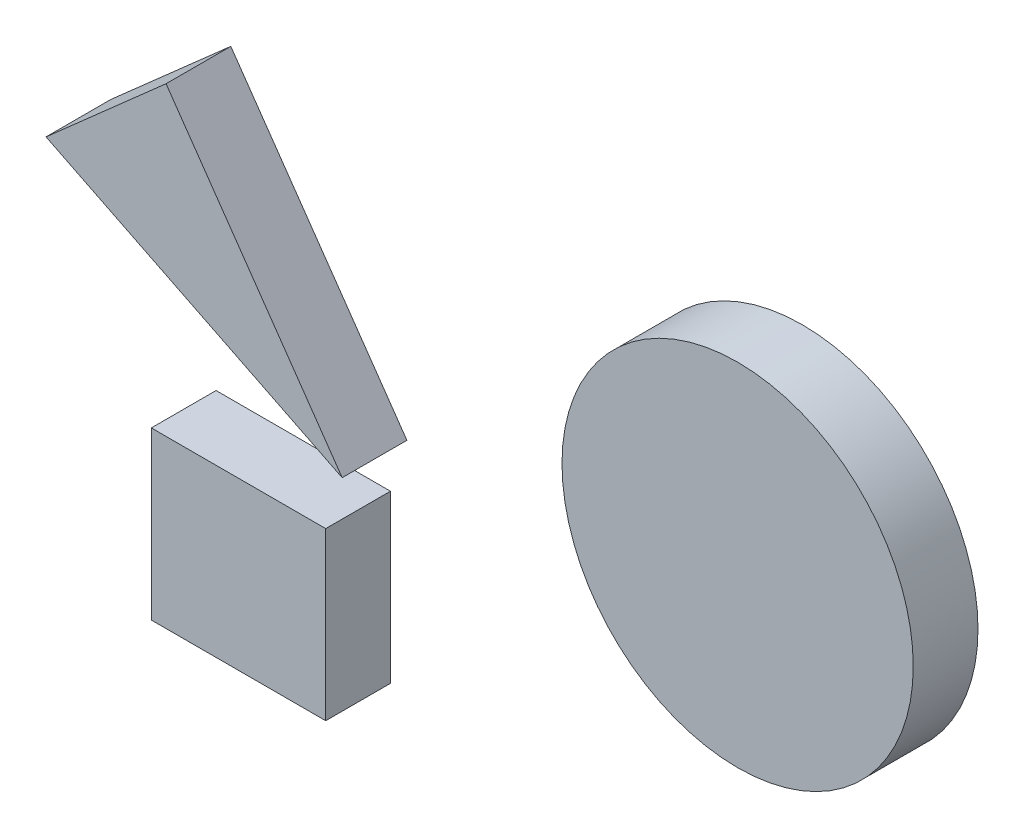
ISO-10303-21;
HEADER;
FILE_DESCRIPTION(('STEP AP214'),'2;1');
FILE_NAME('part.step','',(''),(''),'','','');
FILE_SCHEMA(('AUTOMOTIVE_DESIGN { 1 0 10303 214 1 1 1 1 }'));
ENDSEC;
DATA;
#1=APPLICATION_CONTEXT('core data for automotive mechanical design processes');
#2=APPLICATION_PROTOCOL_DEFINITION('international standard','automotive_design',2000,#1);
#3=PRODUCT_CONTEXT('',#1,'mechanical');
#4=PRODUCT('Part','Part','',(#3));
#5=PRODUCT_RELATED_PRODUCT_CATEGORY('part','',(#4));
#6=PRODUCT_DEFINITION_FORMATION('','',#4);
#7=PRODUCT_DEFINITION_CONTEXT('part definition',#1,'design');
#8=PRODUCT_DEFINITION('design','',#6,#7);
#9=PRODUCT_DEFINITION_SHAPE('','',#8);
#10=(LENGTH_UNIT() NAMED_UNIT(*) SI_UNIT(.MILLI.,.METRE.));
#11=(NAMED_UNIT(*) PLANE_ANGLE_UNIT() SI_UNIT($,.RADIAN.));
#12=(NAMED_UNIT(*) SI_UNIT($,.STERADIAN.) SOLID_ANGLE_UNIT());
#13=UNCERTAINTY_MEASURE_WITH_UNIT(LENGTH_MEASURE(1.E-05),#10,'distance_accuracy_value','');
#14=(GEOMETRIC_REPRESENTATION_CONTEXT(3) GLOBAL_UNCERTAINTY_ASSIGNED_CONTEXT((#13)) GLOBAL_UNIT_ASSIGNED_CONTEXT((#10,
#11,#12)) REPRESENTATION_CONTEXT('',''));
#15=CARTESIAN_POINT('',(0.,0.,0.));
#16=DIRECTION('',(0.,0.,1.));
#17=DIRECTION('',(1.,0.,0.));
#18=AXIS2_PLACEMENT_3D('',#15,#16,#17);
#19=CARTESIAN_POINT('',(-16.7631560250622,25.5869683673241,20.));
#20=DIRECTION('',(-0.820905201785487,-0.5710644881986,0.));
#21=DIRECTION('',(0.5710644881986,-0.820905201785487,0.));
#22=AXIS2_PLACEMENT_3D('',#19,#20,#21);
#23=PLANE('',#22);
#24=DIRECTION('',(-0.5710644881986,0.820905201785487,0.));
#25=VECTOR('',#24,1.);
#26=CARTESIAN_POINT('',(-16.7631560250622,25.5869683673241,10.));
#27=LINE('',#26,#25);
#28=CARTESIAN_POINT('',(-16.7631560250622,25.5869683673241,10.));
#29=VERTEX_POINT('',#28);
#30=CARTESIAN_POINT('',(-43.9603872641036,64.6829882734462,10.));
#31=VERTEX_POINT('',#30);
#32=EDGE_CURVE('E97',#29,#31,#27,.T.);
#33=ORIENTED_EDGE('',*,*,#32,.T.);
#34=DIRECTION('',(0.,0.,-1.));
#35=VECTOR('',#34,1.);
#36=CARTESIAN_POINT('',(-43.9603872641036,64.6829882734462,20.));
#37=LINE('',#36,#35);
#38=CARTESIAN_POINT('',(-43.9603872641036,64.6829882734462,20.));
#39=VERTEX_POINT('',#38);
#40=EDGE_CURVE('E12',#39,#31,#37,.T.);
#41=ORIENTED_EDGE('',*,*,#40,.F.);
#42=DIRECTION('',(-0.5710644881986,0.820905201785487,0.));
#43=VECTOR('',#42,1.);
#44=CARTESIAN_POINT('',(-16.7631560250622,25.5869683673241,20.));
#45=LINE('',#44,#43);
#46=CARTESIAN_POINT('',(-16.7631560250622,25.5869683673241,20.));
#47=VERTEX_POINT('',#46);
#48=EDGE_CURVE('E90',#47,#39,#45,.T.);
#49=ORIENTED_EDGE('',*,*,#48,.F.);
#50=DIRECTION('',(0.,0.,-1.));
#51=VECTOR('',#50,1.);
#52=CARTESIAN_POINT('',(-16.7631560250622,25.5869683673241,20.));
#53=LINE('',#52,#51);
#54=EDGE_CURVE('E98',#47,#29,#53,.T.);
#55=ORIENTED_EDGE('',*,*,#54,.T.);
#56=EDGE_LOOP('',(#33,#41,#49,#55));
#57=FACE_BOUND('',#56,.T.);
#58=ADVANCED_FACE('F50',(#57),#23,.F.);
#59=CARTESIAN_POINT('',(-43.9603872641036,64.6829882734462,20.));
#60=DIRECTION('',(0.662034670407332,-0.749473211781886,0.));
#61=DIRECTION('',(0.749473211781886,0.662034670407332,0.));
#62=AXIS2_PLACEMENT_3D('',#59,#60,#61);
#63=PLANE('',#62);
#64=DIRECTION('',(-0.749473211781886,-0.662034670407332,0.));
#65=VECTOR('',#64,1.);
#66=CARTESIAN_POINT('',(-43.9603872641036,64.6829882734462,10.));
#67=LINE('',#66,#65);
#68=CARTESIAN_POINT('',(-62.5039540179955,48.3028376408416,10.));
#69=VERTEX_POINT('',#68);
#70=EDGE_CURVE('E78',#31,#69,#67,.T.);
#71=ORIENTED_EDGE('',*,*,#70,.T.);
#72=DIRECTION('',(0.,0.,-1.));
#73=VECTOR('',#72,1.);
#74=CARTESIAN_POINT('',(-62.5039540179955,48.3028376408416,20.));
#75=LINE('',#74,#73);
#76=CARTESIAN_POINT('',(-62.5039540179955,48.3028376408416,20.));
#77=VERTEX_POINT('',#76);
#78=EDGE_CURVE('E58',#77,#69,#75,.T.);
#79=ORIENTED_EDGE('',*,*,#78,.F.);
#80=DIRECTION('',(-0.749473211781886,-0.662034670407332,0.));
#81=VECTOR('',#80,1.);
#82=CARTESIAN_POINT('',(-43.9603872641036,64.6829882734462,20.));
#83=LINE('',#82,#81);
#84=EDGE_CURVE('E86',#39,#77,#83,.T.);
#85=ORIENTED_EDGE('',*,*,#84,.F.);
#86=ORIENTED_EDGE('',*,*,#40,.T.);
#87=EDGE_LOOP('',(#71,#79,#85,#86));
#88=FACE_BOUND('',#87,.T.);
#89=ADVANCED_FACE('F87',(#88),#63,.F.);
#90=CARTESIAN_POINT('',(-62.5039540179955,48.3028376408416,20.));
#91=DIRECTION('',(0.444791324667453,0.895634231983443,0.));
#92=DIRECTION('',(-0.895634231983443,0.444791324667453,0.));
#93=AXIS2_PLACEMENT_3D('',#90,#91,#92);
#94=PLANE('',#93);
#95=DIRECTION('',(0.895634231983443,-0.444791324667453,0.));
#96=VECTOR('',#95,1.);
#97=CARTESIAN_POINT('',(-62.5039540179955,48.3028376408416,10.));
#98=LINE('',#97,#96);
#99=EDGE_CURVE('E83',#69,#29,#98,.T.);
#100=ORIENTED_EDGE('',*,*,#99,.T.);
#101=ORIENTED_EDGE('',*,*,#54,.F.);
#102=DIRECTION('',(0.895634231983443,-0.444791324667453,0.));
#103=VECTOR('',#102,1.);
#104=CARTESIAN_POINT('',(-62.5039540179955,48.3028376408416,20.));
#105=LINE('',#104,#103);
#106=EDGE_CURVE('E66',#77,#47,#105,.T.);
#107=ORIENTED_EDGE('',*,*,#106,.F.);
#108=ORIENTED_EDGE('',*,*,#78,.T.);
#109=EDGE_LOOP('',(#100,#101,#107,#108));
#110=FACE_BOUND('',#109,.T.);
#111=ADVANCED_FACE('F105',(#110),#94,.F.);
#112=CARTESIAN_POINT('',(0.,0.,20.));
#113=DIRECTION('',(0.,0.,1.));
#114=DIRECTION('',(1.,0.,0.));
#115=AXIS2_PLACEMENT_3D('',#112,#113,#114);
#116=PLANE('',#115);
#117=ORIENTED_EDGE('',*,*,#48,.T.);
#118=ORIENTED_EDGE('',*,*,#84,.T.);
#119=ORIENTED_EDGE('',*,*,#106,.T.);
#120=EDGE_LOOP('',(#117,#118,#119));
#121=FACE_BOUND('',#120,.T.);
#122=ADVANCED_FACE('F93',(#121),#116,.T.);
#123=CARTESIAN_POINT('',(0.,0.,10.));
#124=DIRECTION('',(0.,0.,1.));
#125=DIRECTION('',(1.,0.,0.));
#126=AXIS2_PLACEMENT_3D('',#123,#124,#125);
#127=PLANE('',#126);
#128=ORIENTED_EDGE('',*,*,#32,.F.);
#129=ORIENTED_EDGE('',*,*,#99,.F.);
#130=ORIENTED_EDGE('',*,*,#70,.F.);
#131=EDGE_LOOP('',(#128,#129,#130));
#132=FACE_BOUND('',#131,.T.);
#133=ADVANCED_FACE('F106',(#132),#127,.F.);
#134=CLOSED_SHELL('',(#58,#89,#111,#122,#133));
#135=MANIFOLD_SOLID_BREP('B2',#134);
#136=CARTESIAN_POINT('',(-46.2357834757217,17.5092419138344,20.));
#137=DIRECTION('',(1.,0.,0.));
#138=DIRECTION('',(0.,0.,-1.));
#139=AXIS2_PLACEMENT_3D('',#136,#137,#138);
#140=PLANE('',#139);
#141=DIRECTION('',(0.,-1.,0.));
#142=VECTOR('',#141,1.);
#143=CARTESIAN_POINT('',(-46.2357834757217,17.5092419138344,10.));
#144=LINE('',#143,#142);
#145=CARTESIAN_POINT('',(-46.2357834757217,17.5092419138344,10.));
#146=VERTEX_POINT('',#145);
#147=CARTESIAN_POINT('',(-46.2357834757217,-8.19315679848669,10.));
#148=VERTEX_POINT('',#147);
#149=EDGE_CURVE('E227',#146,#148,#144,.T.);
#150=ORIENTED_EDGE('',*,*,#149,.T.);
#151=DIRECTION('',(0.,0.,-1.));
#152=VECTOR('',#151,1.);
#153=CARTESIAN_POINT('',(-46.2357834757217,-8.19315679848669,20.));
#154=LINE('',#153,#152);
#155=CARTESIAN_POINT('',(-46.2357834757217,-8.19315679848669,20.));
#156=VERTEX_POINT('',#155);
#157=EDGE_CURVE('E48',#156,#148,#154,.T.);
#158=ORIENTED_EDGE('',*,*,#157,.F.);
#159=DIRECTION('',(0.,-1.,0.));
#160=VECTOR('',#159,1.);
#161=CARTESIAN_POINT('',(-46.2357834757217,17.5092419138344,20.));
#162=LINE('',#161,#160);
#163=CARTESIAN_POINT('',(-46.2357834757217,17.5092419138344,20.));
#164=VERTEX_POINT('',#163);
#165=EDGE_CURVE('E215',#164,#156,#162,.T.);
#166=ORIENTED_EDGE('',*,*,#165,.F.);
#167=DIRECTION('',(0.,0.,-1.));
#168=VECTOR('',#167,1.);
#169=CARTESIAN_POINT('',(-46.2357834757217,17.5092419138344,20.));
#170=LINE('',#169,#168);
#171=EDGE_CURVE('E223',#164,#146,#170,.T.);
#172=ORIENTED_EDGE('',*,*,#171,.T.);
#173=EDGE_LOOP('',(#150,#158,#166,#172));
#174=FACE_BOUND('',#173,.T.);
#175=ADVANCED_FACE('F164',(#174),#140,.F.);
#176=CARTESIAN_POINT('',(-46.2357834757217,-8.19315679848669,20.));
#177=DIRECTION('',(0.,1.,0.));
#178=DIRECTION('',(0.,0.,1.));
#179=AXIS2_PLACEMENT_3D('',#176,#177,#178);
#180=PLANE('',#179);
#181=DIRECTION('',(1.,0.,0.));
#182=VECTOR('',#181,1.);
#183=CARTESIAN_POINT('',(-46.2357834757217,-8.19315679848669,10.));
#184=LINE('',#183,#182);
#185=CARTESIAN_POINT('',(-19.3049612955324,-8.19315679848669,10.));
#186=VERTEX_POINT('',#185);
#187=EDGE_CURVE('E219',#148,#186,#184,.T.);
#188=ORIENTED_EDGE('',*,*,#187,.T.);
#189=DIRECTION('',(0.,0.,-1.));
#190=VECTOR('',#189,1.);
#191=CARTESIAN_POINT('',(-19.3049612955324,-8.19315679848669,20.));
#192=LINE('',#191,#190);
#193=CARTESIAN_POINT('',(-19.3049612955324,-8.19315679848669,20.));
#194=VERTEX_POINT('',#193);
#195=EDGE_CURVE('E172',#194,#186,#192,.T.);
#196=ORIENTED_EDGE('',*,*,#195,.F.);
#197=DIRECTION('',(1.,0.,0.));
#198=VECTOR('',#197,1.);
#199=CARTESIAN_POINT('',(-46.2357834757217,-8.19315679848669,20.));
#200=LINE('',#199,#198);
#201=EDGE_CURVE('E210',#156,#194,#200,.T.);
#202=ORIENTED_EDGE('',*,*,#201,.F.);
#203=ORIENTED_EDGE('',*,*,#157,.T.);
#204=EDGE_LOOP('',(#188,#196,#202,#203));
#205=FACE_BOUND('',#204,.T.);
#206=ADVANCED_FACE('F218',(#205),#180,.F.);
#207=CARTESIAN_POINT('',(-19.3049612955324,17.5092419138344,20.));
#208=DIRECTION('',(-1.,0.,0.));
#209=DIRECTION('',(0.,0.,1.));
#210=AXIS2_PLACEMENT_3D('',#207,#208,#209);
#211=PLANE('',#210);
#212=DIRECTION('',(0.,1.,0.));
#213=VECTOR('',#212,1.);
#214=CARTESIAN_POINT('',(-19.3049612955324,17.5092419138344,10.));
#215=LINE('',#214,#213);
#216=CARTESIAN_POINT('',(-19.3049612955324,17.5092419138344,10.));
#217=VERTEX_POINT('',#216);
#218=EDGE_CURVE('E197',#186,#217,#215,.T.);
#219=ORIENTED_EDGE('',*,*,#218,.T.);
#220=DIRECTION('',(0.,0.,-1.));
#221=VECTOR('',#220,1.);
#222=CARTESIAN_POINT('',(-19.3049612955324,17.5092419138344,20.));
#223=LINE('',#222,#221);
#224=CARTESIAN_POINT('',(-19.3049612955324,17.5092419138344,20.));
#225=VERTEX_POINT('',#224);
#226=EDGE_CURVE('E220',#225,#217,#223,.T.);
#227=ORIENTED_EDGE('',*,*,#226,.F.);
#228=DIRECTION('',(0.,1.,0.));
#229=VECTOR('',#228,1.);
#230=CARTESIAN_POINT('',(-19.3049612955324,17.5092419138344,20.));
#231=LINE('',#230,#229);
#232=EDGE_CURVE('E213',#194,#225,#231,.T.);
#233=ORIENTED_EDGE('',*,*,#232,.F.);
#234=ORIENTED_EDGE('',*,*,#195,.T.);
#235=EDGE_LOOP('',(#219,#227,#233,#234));
#236=FACE_BOUND('',#235,.T.);
#237=ADVANCED_FACE('F221',(#236),#211,.F.);
#238=CARTESIAN_POINT('',(-46.2357834757217,17.5092419138344,20.));
#239=DIRECTION('',(0.,-1.,0.));
#240=DIRECTION('',(0.,0.,-1.));
#241=AXIS2_PLACEMENT_3D('',#238,#239,#240);
#242=PLANE('',#241);
#243=DIRECTION('',(-1.,0.,0.));
#244=VECTOR('',#243,1.);
#245=CARTESIAN_POINT('',(-46.2357834757217,17.5092419138344,10.));
#246=LINE('',#245,#244);
#247=EDGE_CURVE('E203',#217,#146,#246,.T.);
#248=ORIENTED_EDGE('',*,*,#247,.T.);
#249=ORIENTED_EDGE('',*,*,#171,.F.);
#250=DIRECTION('',(-1.,0.,0.));
#251=VECTOR('',#250,1.);
#252=CARTESIAN_POINT('',(-46.2357834757217,17.5092419138344,20.));
#253=LINE('',#252,#251);
#254=EDGE_CURVE('E180',#225,#164,#253,.T.);
#255=ORIENTED_EDGE('',*,*,#254,.F.);
#256=ORIENTED_EDGE('',*,*,#226,.T.);
#257=EDGE_LOOP('',(#248,#249,#255,#256));
#258=FACE_BOUND('',#257,.T.);
#259=ADVANCED_FACE('F234',(#258),#242,.F.);
#260=CARTESIAN_POINT('',(0.,0.,20.));
#261=DIRECTION('',(0.,0.,1.));
#262=DIRECTION('',(1.,0.,0.));
#263=AXIS2_PLACEMENT_3D('',#260,#261,#262);
#264=PLANE('',#263);
#265=ORIENTED_EDGE('',*,*,#165,.T.);
#266=ORIENTED_EDGE('',*,*,#201,.T.);
#267=ORIENTED_EDGE('',*,*,#232,.T.);
#268=ORIENTED_EDGE('',*,*,#254,.T.);
#269=EDGE_LOOP('',(#265,#266,#267,#268));
#270=FACE_BOUND('',#269,.T.);
#271=ADVANCED_FACE('F211',(#270),#264,.T.);
#272=CARTESIAN_POINT('',(0.,0.,10.));
#273=DIRECTION('',(0.,0.,1.));
#274=DIRECTION('',(1.,0.,0.));
#275=AXIS2_PLACEMENT_3D('',#272,#273,#274);
#276=PLANE('',#275);
#277=ORIENTED_EDGE('',*,*,#149,.F.);
#278=ORIENTED_EDGE('',*,*,#247,.F.);
#279=ORIENTED_EDGE('',*,*,#218,.F.);
#280=ORIENTED_EDGE('',*,*,#187,.F.);
#281=EDGE_LOOP('',(#277,#278,#279,#280));
#282=FACE_BOUND('',#281,.T.);
#283=ADVANCED_FACE('F237',(#282),#276,.F.);
#284=CLOSED_SHELL('',(#175,#206,#237,#259,#271,#283));
#285=MANIFOLD_SOLID_BREP('B6',#284);
#286=CARTESIAN_POINT('',(34.3129197926042,34.4570952924627,10.));
#287=DIRECTION('',(0.,0.,-1.));
#288=DIRECTION('',(-1.,0.,0.));
#289=AXIS2_PLACEMENT_3D('',#286,#287,#288);
#290=CYLINDRICAL_SURFACE('',#289,27.1249242696092);
#291=CARTESIAN_POINT('',(34.3129197926042,34.4570952924627,10.));
#292=DIRECTION('',(0.,0.,1.));
#293=DIRECTION('',(1.,0.,0.));
#294=AXIS2_PLACEMENT_3D('',#291,#292,#293);
#295=CIRCLE('',#294,27.1249242696092);
#296=CARTESIAN_POINT('',(61.4378440622134,34.4570952924627,10.));
#297=VERTEX_POINT('',#296);
#298=EDGE_CURVE('E163',#297,#297,#295,.T.);
#299=ORIENTED_EDGE('',*,*,#298,.F.);
#300=EDGE_LOOP('',(#299));
#301=FACE_BOUND('',#300,.T.);
#302=CARTESIAN_POINT('',(34.3129197926042,34.4570952924627,0.));
#303=DIRECTION('',(0.,0.,1.));
#304=DIRECTION('',(1.,0.,0.));
#305=AXIS2_PLACEMENT_3D('',#302,#303,#304);
#306=CIRCLE('',#305,27.1249242696092);
#307=CARTESIAN_POINT('',(61.4378440622134,34.4570952924627,0.));
#308=VERTEX_POINT('',#307);
#309=EDGE_CURVE('E302',#308,#308,#306,.T.);
#310=ORIENTED_EDGE('',*,*,#309,.T.);
#311=EDGE_LOOP('',(#310));
#312=FACE_BOUND('',#311,.T.);
#313=ADVANCED_FACE('F299',(#301,#312),#290,.T.);
#314=CARTESIAN_POINT('',(34.3129197926042,34.4570952924627,10.));
#315=DIRECTION('',(0.,0.,1.));
#316=DIRECTION('',(1.,0.,0.));
#317=AXIS2_PLACEMENT_3D('',#314,#315,#316);
#318=PLANE('',#317);
#319=ORIENTED_EDGE('',*,*,#298,.T.);
#320=EDGE_LOOP('',(#319));
#321=FACE_BOUND('',#320,.T.);
#322=ADVANCED_FACE('F314',(#321),#318,.T.);
#323=CARTESIAN_POINT('',(34.3129197926042,34.4570952924627,0.));
#324=DIRECTION('',(0.,0.,1.));
#325=DIRECTION('',(1.,0.,0.));
#326=AXIS2_PLACEMENT_3D('',#323,#324,#325);
#327=PLANE('',#326);
#328=ORIENTED_EDGE('',*,*,#309,.F.);
#329=EDGE_LOOP('',(#328));
#330=FACE_BOUND('',#329,.T.);
#331=ADVANCED_FACE('F312',(#330),#327,.F.);
#332=CLOSED_SHELL('',(#313,#322,#331));
#333=MANIFOLD_SOLID_BREP('B42',#332);
#334=ADVANCED_BREP_SHAPE_REPRESENTATION('',(#18,#135,#285,#333),#14);
#335=SHAPE_DEFINITION_REPRESENTATION(#9,#334);
ENDSEC;
END-ISO-10303-21;
